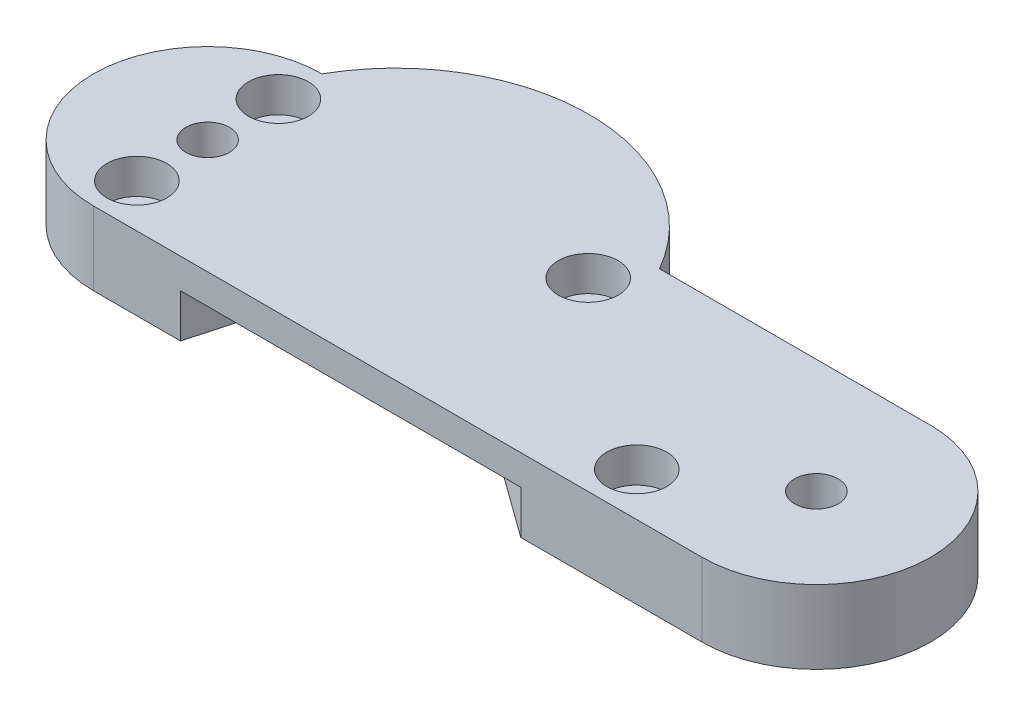
ISO-10303-21;
HEADER;
FILE_DESCRIPTION(('STEP AP214'),'2;1');
FILE_NAME('part.step','',(''),(''),'','','');
FILE_SCHEMA(('AUTOMOTIVE_DESIGN { 1 0 10303 214 1 1 1 1 }'));
ENDSEC;
DATA;
#1=APPLICATION_CONTEXT('core data for automotive mechanical design processes');
#2=APPLICATION_PROTOCOL_DEFINITION('international standard','automotive_design',2000,#1);
#3=PRODUCT_CONTEXT('',#1,'mechanical');
#4=PRODUCT('Part','Part','',(#3));
#5=PRODUCT_RELATED_PRODUCT_CATEGORY('part','',(#4));
#6=PRODUCT_DEFINITION_FORMATION('','',#4);
#7=PRODUCT_DEFINITION_CONTEXT('part definition',#1,'design');
#8=PRODUCT_DEFINITION('design','',#6,#7);
#9=PRODUCT_DEFINITION_SHAPE('','',#8);
#10=(LENGTH_UNIT() NAMED_UNIT(*) SI_UNIT(.MILLI.,.METRE.));
#11=(NAMED_UNIT(*) PLANE_ANGLE_UNIT() SI_UNIT($,.RADIAN.));
#12=(NAMED_UNIT(*) SI_UNIT($,.STERADIAN.) SOLID_ANGLE_UNIT());
#13=UNCERTAINTY_MEASURE_WITH_UNIT(LENGTH_MEASURE(1.E-05),#10,'distance_accuracy_value','');
#14=(GEOMETRIC_REPRESENTATION_CONTEXT(3) GLOBAL_UNCERTAINTY_ASSIGNED_CONTEXT((#13)) GLOBAL_UNIT_ASSIGNED_CONTEXT((#10,
#11,#12)) REPRESENTATION_CONTEXT('',''));
#15=CARTESIAN_POINT('',(0.,0.,0.));
#16=DIRECTION('',(0.,0.,1.));
#17=DIRECTION('',(1.,0.,0.));
#18=AXIS2_PLACEMENT_3D('',#15,#16,#17);
#19=CARTESIAN_POINT('',(0.,2.,0.));
#20=DIRECTION('',(0.,1.,0.));
#21=DIRECTION('',(0.,0.,-1.));
#22=AXIS2_PLACEMENT_3D('',#19,#20,#21);
#23=PLANE('',#22);
#24=CARTESIAN_POINT('',(-55.9305382801715,2.,-6.5003992165423));
#25=DIRECTION('',(0.,-1.,0.));
#26=DIRECTION('',(0.,0.,-1.));
#27=AXIS2_PLACEMENT_3D('',#24,#25,#26);
#28=CIRCLE('',#27,1.5);
#29=CARTESIAN_POINT('',(-55.9305382801715,2.,-8.00039921654231));
#30=VERTEX_POINT('',#29);
#31=EDGE_CURVE('E256',#30,#30,#28,.F.);
#32=ORIENTED_EDGE('',*,*,#31,.T.);
#33=EDGE_LOOP('',(#32));
#34=FACE_BOUND('',#33,.T.);
#35=CARTESIAN_POINT('',(-55.9305382801715,2.,0.));
#36=DIRECTION('',(0.,-1.,0.));
#37=DIRECTION('',(0.,0.,-1.));
#38=AXIS2_PLACEMENT_3D('',#35,#36,#37);
#39=CIRCLE('',#38,2.);
#40=CARTESIAN_POINT('',(-55.9305382801715,2.,-2.));
#41=VERTEX_POINT('',#40);
#42=EDGE_CURVE('E11',#41,#41,#39,.T.);
#43=ORIENTED_EDGE('',*,*,#42,.F.);
#44=EDGE_LOOP('',(#43));
#45=FACE_BOUND('',#44,.T.);
#46=CARTESIAN_POINT('',(-55.9305382801715,2.,0.));
#47=DIRECTION('',(0.,-1.,0.));
#48=DIRECTION('',(0.,0.,-1.));
#49=AXIS2_PLACEMENT_3D('',#46,#47,#48);
#50=CIRCLE('',#49,10.5003992165423);
#51=CARTESIAN_POINT('',(-55.9305382801715,2.,10.5003992165423));
#52=VERTEX_POINT('',#51);
#53=CARTESIAN_POINT('',(-55.9305382801715,2.,-10.5003992165423));
#54=VERTEX_POINT('',#53);
#55=EDGE_CURVE('E240',#52,#54,#50,.T.);
#56=ORIENTED_EDGE('',*,*,#55,.T.);
#57=CARTESIAN_POINT('',(-40.4241193156667,2.,-1.7460511013579));
#58=DIRECTION('',(0.,-1.,0.));
#59=DIRECTION('',(0.,0.,-1.));
#60=AXIS2_PLACEMENT_3D('',#57,#58,#59);
#61=CIRCLE('',#60,17.8069548217708);
#62=CARTESIAN_POINT('',(-54.8543825263999,2.,-12.1794179449777));
#63=VERTEX_POINT('',#62);
#64=EDGE_CURVE('E254',#54,#63,#61,.T.);
#65=ORIENTED_EDGE('',*,*,#64,.T.);
#66=DIRECTION('',(0.810372315489383,0.,0.585915275691269));
#67=VECTOR('',#66,1.);
#68=CARTESIAN_POINT('',(-43.8872651072943,2.,-4.24997427651618));
#69=LINE('',#68,#67);
#70=CARTESIAN_POINT('',(-43.8872651072943,2.,-4.24997427651618));
#71=VERTEX_POINT('',#70);
#72=EDGE_CURVE('E206',#63,#71,#69,.T.);
#73=ORIENTED_EDGE('',*,*,#72,.T.);
#74=DIRECTION('',(-0.263153614525289,0.,0.964753945398657));
#75=VECTOR('',#74,1.);
#76=CARTESIAN_POINT('',(-43.8872651072943,2.,-4.24997427651618));
#77=LINE('',#76,#75);
#78=CARTESIAN_POINT('',(-47.9106890267398,2.,10.5003992165423));
#79=VERTEX_POINT('',#78);
#80=EDGE_CURVE('E193',#71,#79,#77,.T.);
#81=ORIENTED_EDGE('',*,*,#80,.T.);
#82=DIRECTION('',(-1.,0.,0.));
#83=VECTOR('',#82,1.);
#84=CARTESIAN_POINT('',(0.,2.,10.5003992165423));
#85=LINE('',#84,#83);
#86=EDGE_CURVE('E251',#79,#52,#85,.T.);
#87=ORIENTED_EDGE('',*,*,#86,.T.);
#88=EDGE_LOOP('',(#56,#65,#73,#81,#87));
#89=FACE_BOUND('',#88,.T.);
#90=CARTESIAN_POINT('',(-55.9305382801715,2.,6.5003992165423));
#91=DIRECTION('',(0.,-1.,0.));
#92=DIRECTION('',(0.,0.,-1.));
#93=AXIS2_PLACEMENT_3D('',#90,#91,#92);
#94=CIRCLE('',#93,1.5);
#95=CARTESIAN_POINT('',(-55.9305382801715,2.,5.0003992165423));
#96=VERTEX_POINT('',#95);
#97=EDGE_CURVE('E261',#96,#96,#94,.F.);
#98=ORIENTED_EDGE('',*,*,#97,.T.);
#99=EDGE_LOOP('',(#98));
#100=FACE_BOUND('',#99,.T.);
#101=ADVANCED_FACE('F37',(#34,#45,#89,#100),#23,.F.);
#102=CARTESIAN_POINT('',(-41.5933955268113,2.,-5.05946240908561));
#103=DIRECTION('',(0.,-1.,0.));
#104=DIRECTION('',(0.,0.,1.));
#105=AXIS2_PLACEMENT_3D('',#102,#103,#104);
#106=PLANE('',#105);
#107=CARTESIAN_POINT('',(0.,2.,0.));
#108=DIRECTION('',(0.,1.,0.));
#109=DIRECTION('',(0.,0.,1.));
#110=AXIS2_PLACEMENT_3D('',#107,#108,#109);
#111=CIRCLE('',#110,2.);
#112=CARTESIAN_POINT('',(0.,2.,2.));
#113=VERTEX_POINT('',#112);
#114=EDGE_CURVE('E147',#113,#113,#111,.T.);
#115=ORIENTED_EDGE('',*,*,#114,.T.);
#116=EDGE_LOOP('',(#115));
#117=FACE_BOUND('',#116,.T.);
#118=DIRECTION('',(1.,0.,0.));
#119=VECTOR('',#118,1.);
#120=CARTESIAN_POINT('',(-12.458850175581,2.,-10.5003992165423));
#121=LINE('',#120,#119);
#122=CARTESIAN_POINT('',(-24.917700351162,2.,-10.5003992165423));
#123=VERTEX_POINT('',#122);
#124=CARTESIAN_POINT('',(0.,2.,-10.5003992165423));
#125=VERTEX_POINT('',#124);
#126=EDGE_CURVE('E128',#123,#125,#121,.T.);
#127=ORIENTED_EDGE('',*,*,#126,.T.);
#128=CARTESIAN_POINT('',(0.,2.,0.));
#129=DIRECTION('',(0.,1.,0.));
#130=DIRECTION('',(0.,0.,1.));
#131=AXIS2_PLACEMENT_3D('',#128,#129,#130);
#132=CIRCLE('',#131,10.5003992165423);
#133=CARTESIAN_POINT('',(0.,2.,10.5003992165423));
#134=VERTEX_POINT('',#133);
#135=EDGE_CURVE('E135',#125,#134,#132,.F.);
#136=ORIENTED_EDGE('',*,*,#135,.T.);
#137=DIRECTION('',(-1.,0.,0.));
#138=VECTOR('',#137,1.);
#139=CARTESIAN_POINT('',(-4.6195471407067,2.,10.5003992165423));
#140=LINE('',#139,#138);
#141=CARTESIAN_POINT('',(-16.659276720951,2.,10.5003992165423));
#142=VERTEX_POINT('',#141);
#143=EDGE_CURVE('E141',#134,#142,#140,.T.);
#144=ORIENTED_EDGE('',*,*,#143,.T.);
#145=DIRECTION('',(-0.810372315489383,0.,-0.585915275691269));
#146=VECTOR('',#145,1.);
#147=CARTESIAN_POINT('',(26.6452391554762,2.,41.8104240945407));
#148=LINE('',#147,#146);
#149=CARTESIAN_POINT('',(-39.2995259463282,2.,-5.86895054165502));
#150=VERTEX_POINT('',#149);
#151=EDGE_CURVE('E189',#142,#150,#148,.T.);
#152=ORIENTED_EDGE('',*,*,#151,.T.);
#153=DIRECTION('',(0.263153614525288,0.,-0.964753945398658));
#154=VECTOR('',#153,1.);
#155=CARTESIAN_POINT('',(-35.7518279113757,2.,-18.8752536565782));
#156=LINE('',#155,#154);
#157=CARTESIAN_POINT('',(-35.7381547906292,2.,-18.9253810211969));
#158=VERTEX_POINT('',#157);
#159=EDGE_CURVE('E204',#150,#158,#156,.T.);
#160=ORIENTED_EDGE('',*,*,#159,.T.);
#161=EDGE_CURVE('E146',#158,#123,#61,.T.);
#162=ORIENTED_EDGE('',*,*,#161,.T.);
#163=EDGE_LOOP('',(#127,#136,#144,#152,#160,#162));
#164=FACE_BOUND('',#163,.T.);
#165=CARTESIAN_POINT('',(-10.,2.,6.5003992165423));
#166=DIRECTION('',(0.,-1.,0.));
#167=DIRECTION('',(0.,0.,-1.));
#168=AXIS2_PLACEMENT_3D('',#165,#166,#167);
#169=CIRCLE('',#168,1.5);
#170=CARTESIAN_POINT('',(-10.,2.,5.0003992165423));
#171=VERTEX_POINT('',#170);
#172=EDGE_CURVE('E263',#171,#171,#169,.F.);
#173=ORIENTED_EDGE('',*,*,#172,.T.);
#174=EDGE_LOOP('',(#173));
#175=FACE_BOUND('',#174,.T.);
#176=CARTESIAN_POINT('',(-27.4615510728353,2.,-6.5003992165423));
#177=DIRECTION('',(0.,-1.,0.));
#178=DIRECTION('',(0.,0.,-1.));
#179=AXIS2_PLACEMENT_3D('',#176,#177,#178);
#180=CIRCLE('',#179,1.5);
#181=CARTESIAN_POINT('',(-27.4615510728353,2.,-8.00039921654231));
#182=VERTEX_POINT('',#181);
#183=EDGE_CURVE('E40',#182,#182,#180,.F.);
#184=ORIENTED_EDGE('',*,*,#183,.T.);
#185=EDGE_LOOP('',(#184));
#186=FACE_BOUND('',#185,.T.);
#187=ADVANCED_FACE('F143',(#117,#164,#175,#186),#106,.T.);
#188=CARTESIAN_POINT('',(-55.9305382801715,5.55,6.5003992165423));
#189=DIRECTION('',(0.,1.,0.));
#190=DIRECTION('',(0.,0.,-1.));
#191=AXIS2_PLACEMENT_3D('',#188,#189,#190);
#192=CYLINDRICAL_SURFACE('',#191,2.75);
#193=CARTESIAN_POINT('',(-55.9305382801715,5.55,6.5003992165423));
#194=DIRECTION('',(0.,-1.,0.));
#195=DIRECTION('',(0.,0.,-1.));
#196=AXIS2_PLACEMENT_3D('',#193,#194,#195);
#197=CIRCLE('',#196,2.75);
#198=CARTESIAN_POINT('',(-55.9305382801715,5.55,3.7503992165423));
#199=VERTEX_POINT('',#198);
#200=EDGE_CURVE('E172',#199,#199,#197,.T.);
#201=ORIENTED_EDGE('',*,*,#200,.T.);
#202=EDGE_LOOP('',(#201));
#203=FACE_BOUND('',#202,.T.);
#204=CARTESIAN_POINT('',(-55.9305382801715,8.75,6.5003992165423));
#205=DIRECTION('',(0.,-1.,0.));
#206=DIRECTION('',(0.,0.,-1.));
#207=AXIS2_PLACEMENT_3D('',#204,#205,#206);
#208=CIRCLE('',#207,2.75);
#209=CARTESIAN_POINT('',(-55.9305382801715,8.75,3.7503992165423));
#210=VERTEX_POINT('',#209);
#211=EDGE_CURVE('E157',#210,#210,#208,.T.);
#212=ORIENTED_EDGE('',*,*,#211,.F.);
#213=EDGE_LOOP('',(#212));
#214=FACE_BOUND('',#213,.T.);
#215=ADVANCED_FACE('F295',(#203,#214),#192,.F.);
#216=CARTESIAN_POINT('',(-55.9305382801715,5.55,-6.5003992165423));
#217=DIRECTION('',(0.,1.,0.));
#218=DIRECTION('',(0.,0.,-1.));
#219=AXIS2_PLACEMENT_3D('',#216,#217,#218);
#220=CYLINDRICAL_SURFACE('',#219,2.75);
#221=CARTESIAN_POINT('',(-55.9305382801715,5.55,-6.5003992165423));
#222=DIRECTION('',(0.,-1.,0.));
#223=DIRECTION('',(0.,0.,-1.));
#224=AXIS2_PLACEMENT_3D('',#221,#222,#223);
#225=CIRCLE('',#224,2.75);
#226=CARTESIAN_POINT('',(-55.9305382801715,5.55,-9.2503992165423));
#227=VERTEX_POINT('',#226);
#228=EDGE_CURVE('E154',#227,#227,#225,.T.);
#229=ORIENTED_EDGE('',*,*,#228,.T.);
#230=EDGE_LOOP('',(#229));
#231=FACE_BOUND('',#230,.T.);
#232=CARTESIAN_POINT('',(-55.9305382801715,8.75,-6.5003992165423));
#233=DIRECTION('',(0.,-1.,0.));
#234=DIRECTION('',(0.,0.,-1.));
#235=AXIS2_PLACEMENT_3D('',#232,#233,#234);
#236=CIRCLE('',#235,2.75);
#237=CARTESIAN_POINT('',(-55.9305382801715,8.75,-9.2503992165423));
#238=VERTEX_POINT('',#237);
#239=EDGE_CURVE('E158',#238,#238,#236,.T.);
#240=ORIENTED_EDGE('',*,*,#239,.F.);
#241=EDGE_LOOP('',(#240));
#242=FACE_BOUND('',#241,.T.);
#243=ADVANCED_FACE('F329',(#231,#242),#220,.F.);
#244=CARTESIAN_POINT('',(-27.4615510728353,5.55,-6.5003992165423));
#245=DIRECTION('',(0.,1.,0.));
#246=DIRECTION('',(0.,0.,-1.));
#247=AXIS2_PLACEMENT_3D('',#244,#245,#246);
#248=CYLINDRICAL_SURFACE('',#247,2.75);
#249=CARTESIAN_POINT('',(-27.4615510728353,5.55,-6.5003992165423));
#250=DIRECTION('',(0.,-1.,0.));
#251=DIRECTION('',(0.,0.,-1.));
#252=AXIS2_PLACEMENT_3D('',#249,#250,#251);
#253=CIRCLE('',#252,2.75);
#254=CARTESIAN_POINT('',(-27.4615510728353,5.55,-9.2503992165423));
#255=VERTEX_POINT('',#254);
#256=EDGE_CURVE('E161',#255,#255,#253,.T.);
#257=ORIENTED_EDGE('',*,*,#256,.T.);
#258=EDGE_LOOP('',(#257));
#259=FACE_BOUND('',#258,.T.);
#260=CARTESIAN_POINT('',(-27.4615510728353,8.75,-6.5003992165423));
#261=DIRECTION('',(0.,-1.,0.));
#262=DIRECTION('',(0.,0.,-1.));
#263=AXIS2_PLACEMENT_3D('',#260,#261,#262);
#264=CIRCLE('',#263,2.75);
#265=CARTESIAN_POINT('',(-27.4615510728353,8.75,-9.2503992165423));
#266=VERTEX_POINT('',#265);
#267=EDGE_CURVE('E164',#266,#266,#264,.T.);
#268=ORIENTED_EDGE('',*,*,#267,.F.);
#269=EDGE_LOOP('',(#268));
#270=FACE_BOUND('',#269,.T.);
#271=ADVANCED_FACE('F473',(#259,#270),#248,.F.);
#272=CARTESIAN_POINT('',(-10.,5.55,6.5003992165423));
#273=DIRECTION('',(0.,1.,0.));
#274=DIRECTION('',(0.,0.,-1.));
#275=AXIS2_PLACEMENT_3D('',#272,#273,#274);
#276=CYLINDRICAL_SURFACE('',#275,2.75);
#277=CARTESIAN_POINT('',(-10.,5.55,6.5003992165423));
#278=DIRECTION('',(0.,-1.,0.));
#279=DIRECTION('',(0.,0.,-1.));
#280=AXIS2_PLACEMENT_3D('',#277,#278,#279);
#281=CIRCLE('',#280,2.75);
#282=CARTESIAN_POINT('',(-10.,5.55,3.7503992165423));
#283=VERTEX_POINT('',#282);
#284=EDGE_CURVE('E167',#283,#283,#281,.T.);
#285=ORIENTED_EDGE('',*,*,#284,.T.);
#286=EDGE_LOOP('',(#285));
#287=FACE_BOUND('',#286,.T.);
#288=CARTESIAN_POINT('',(-10.,8.75,6.5003992165423));
#289=DIRECTION('',(0.,-1.,0.));
#290=DIRECTION('',(0.,0.,-1.));
#291=AXIS2_PLACEMENT_3D('',#288,#289,#290);
#292=CIRCLE('',#291,2.75);
#293=CARTESIAN_POINT('',(-10.,8.75,3.7503992165423));
#294=VERTEX_POINT('',#293);
#295=EDGE_CURVE('E150',#294,#294,#292,.T.);
#296=ORIENTED_EDGE('',*,*,#295,.F.);
#297=EDGE_LOOP('',(#296));
#298=FACE_BOUND('',#297,.T.);
#299=ADVANCED_FACE('F326',(#287,#298),#276,.F.);
#300=CARTESIAN_POINT('',(-35.7518279113757,6.,-18.8752536565782));
#301=DIRECTION('',(0.964753945398658,0.,0.263153614525288));
#302=DIRECTION('',(0.263153614525288,0.,-0.964753945398658));
#303=AXIS2_PLACEMENT_3D('',#300,#301,#302);
#304=PLANE('',#303);
#305=DIRECTION('',(0.263153614525288,0.,-0.964753945398658));
#306=VECTOR('',#305,1.);
#307=CARTESIAN_POINT('',(-35.7518279113757,6.,-18.8752536565782));
#308=LINE('',#307,#306);
#309=CARTESIAN_POINT('',(-39.2995259463282,6.,-5.86895054165502));
#310=VERTEX_POINT('',#309);
#311=CARTESIAN_POINT('',(-35.7381547906292,6.,-18.9253810211969));
#312=VERTEX_POINT('',#311);
#313=EDGE_CURVE('E192',#310,#312,#308,.T.);
#314=ORIENTED_EDGE('',*,*,#313,.T.);
#315=DIRECTION('',(0.,-1.,0.));
#316=VECTOR('',#315,1.);
#317=CARTESIAN_POINT('',(-35.7381547906292,6.,-18.9253810211969));
#318=LINE('',#317,#316);
#319=EDGE_CURVE('E181',#312,#158,#318,.T.);
#320=ORIENTED_EDGE('',*,*,#319,.T.);
#321=ORIENTED_EDGE('',*,*,#159,.F.);
#322=DIRECTION('',(0.,-1.,0.));
#323=VECTOR('',#322,1.);
#324=CARTESIAN_POINT('',(-39.2995259463282,6.,-5.86895054165502));
#325=LINE('',#324,#323);
#326=EDGE_CURVE('E201',#310,#150,#325,.T.);
#327=ORIENTED_EDGE('',*,*,#326,.F.);
#328=EDGE_LOOP('',(#314,#320,#321,#327));
#329=FACE_BOUND('',#328,.T.);
#330=ADVANCED_FACE('F336',(#329),#304,.F.);
#331=CARTESIAN_POINT('',(-40.4241193156667,-33.0570550282,-1.7460511013579));
#332=DIRECTION('',(0.,1.,0.));
#333=DIRECTION('',(0.,0.,-1.));
#334=AXIS2_PLACEMENT_3D('',#331,#332,#333);
#335=CYLINDRICAL_SURFACE('',#334,17.8069548217708);
#336=ORIENTED_EDGE('',*,*,#319,.F.);
#337=CARTESIAN_POINT('',(-40.4241193156667,6.,-1.7460511013579));
#338=DIRECTION('',(0.,1.,0.));
#339=DIRECTION('',(0.,0.,1.));
#340=AXIS2_PLACEMENT_3D('',#337,#338,#339);
#341=CIRCLE('',#340,17.8069548217708);
#342=CARTESIAN_POINT('',(-54.8543825263999,6.,-12.1794179449777));
#343=VERTEX_POINT('',#342);
#344=EDGE_CURVE('E178',#312,#343,#341,.T.);
#345=ORIENTED_EDGE('',*,*,#344,.T.);
#346=DIRECTION('',(0.,-1.,0.));
#347=VECTOR('',#346,1.);
#348=CARTESIAN_POINT('',(-54.8543825263999,6.,-12.1794179449777));
#349=LINE('',#348,#347);
#350=EDGE_CURVE('E183',#343,#63,#349,.T.);
#351=ORIENTED_EDGE('',*,*,#350,.T.);
#352=ORIENTED_EDGE('',*,*,#64,.F.);
#353=DIRECTION('',(0.,1.,0.));
#354=VECTOR('',#353,1.);
#355=CARTESIAN_POINT('',(-55.9305382801715,-0.75,-10.5003992165423));
#356=LINE('',#355,#354);
#357=CARTESIAN_POINT('',(-55.9305382801715,8.75,-10.5003992165423));
#358=VERTEX_POINT('',#357);
#359=EDGE_CURVE('E60',#54,#358,#356,.T.);
#360=ORIENTED_EDGE('',*,*,#359,.T.);
#361=CARTESIAN_POINT('',(-40.4241193156667,8.75,-1.7460511013579));
#362=DIRECTION('',(0.,1.,0.));
#363=DIRECTION('',(0.,0.,1.));
#364=AXIS2_PLACEMENT_3D('',#361,#362,#363);
#365=CIRCLE('',#364,17.8069548217708);
#366=CARTESIAN_POINT('',(-24.917700351162,8.75,-10.5003992165423));
#367=VERTEX_POINT('',#366);
#368=EDGE_CURVE('E185',#358,#367,#365,.F.);
#369=ORIENTED_EDGE('',*,*,#368,.T.);
#370=DIRECTION('',(0.,1.,0.));
#371=VECTOR('',#370,1.);
#372=CARTESIAN_POINT('',(-24.917700351162,-33.0570550282,-10.5003992165423));
#373=LINE('',#372,#371);
#374=EDGE_CURVE('E52',#123,#367,#373,.T.);
#375=ORIENTED_EDGE('',*,*,#374,.F.);
#376=ORIENTED_EDGE('',*,*,#161,.F.);
#377=EDGE_LOOP('',(#336,#345,#351,#352,#360,#369,#375,#376));
#378=FACE_BOUND('',#377,.T.);
#379=ADVANCED_FACE('F332',(#378),#335,.T.);
#380=CARTESIAN_POINT('',(-55.9305382801715,-0.75,0.));
#381=DIRECTION('',(0.,1.,0.));
#382=DIRECTION('',(0.,0.,-1.));
#383=AXIS2_PLACEMENT_3D('',#380,#381,#382);
#384=CYLINDRICAL_SURFACE('',#383,10.5003992165423);
#385=DIRECTION('',(0.,1.,0.));
#386=VECTOR('',#385,1.);
#387=CARTESIAN_POINT('',(-55.9305382801715,-0.75,10.5003992165423));
#388=LINE('',#387,#386);
#389=CARTESIAN_POINT('',(-55.9305382801715,8.75,10.5003992165423));
#390=VERTEX_POINT('',#389);
#391=EDGE_CURVE('E230',#52,#390,#388,.T.);
#392=ORIENTED_EDGE('',*,*,#391,.T.);
#393=CARTESIAN_POINT('',(-55.9305382801715,8.75,0.));
#394=DIRECTION('',(0.,1.,0.));
#395=DIRECTION('',(0.,0.,1.));
#396=AXIS2_PLACEMENT_3D('',#393,#394,#395);
#397=CIRCLE('',#396,10.5003992165423);
#398=EDGE_CURVE('E223',#358,#390,#397,.T.);
#399=ORIENTED_EDGE('',*,*,#398,.F.);
#400=ORIENTED_EDGE('',*,*,#359,.F.);
#401=ORIENTED_EDGE('',*,*,#55,.F.);
#402=EDGE_LOOP('',(#392,#399,#400,#401));
#403=FACE_BOUND('',#402,.T.);
#404=ADVANCED_FACE('F335',(#403),#384,.T.);
#405=CARTESIAN_POINT('',(-43.8872651072943,6.,-4.24997427651618));
#406=DIRECTION('',(-0.964753945398657,0.,-0.263153614525289));
#407=DIRECTION('',(-0.263153614525289,0.,0.964753945398657));
#408=AXIS2_PLACEMENT_3D('',#405,#406,#407);
#409=PLANE('',#408);
#410=DIRECTION('',(-0.263153614525289,0.,0.964753945398657));
#411=VECTOR('',#410,1.);
#412=CARTESIAN_POINT('',(-43.8872651072943,6.,-4.24997427651618));
#413=LINE('',#412,#411);
#414=CARTESIAN_POINT('',(-43.8872651072943,6.,-4.24997427651618));
#415=VERTEX_POINT('',#414);
#416=CARTESIAN_POINT('',(-47.9106890267398,6.,10.5003992165423));
#417=VERTEX_POINT('',#416);
#418=EDGE_CURVE('E198',#415,#417,#413,.T.);
#419=ORIENTED_EDGE('',*,*,#418,.T.);
#420=DIRECTION('',(0.,-1.,0.));
#421=VECTOR('',#420,1.);
#422=CARTESIAN_POINT('',(-47.9106890267398,-0.75,10.5003992165423));
#423=LINE('',#422,#421);
#424=EDGE_CURVE('E132',#417,#79,#423,.T.);
#425=ORIENTED_EDGE('',*,*,#424,.T.);
#426=ORIENTED_EDGE('',*,*,#80,.F.);
#427=DIRECTION('',(0.,-1.,0.));
#428=VECTOR('',#427,1.);
#429=CARTESIAN_POINT('',(-43.8872651072943,6.,-4.24997427651618));
#430=LINE('',#429,#428);
#431=EDGE_CURVE('E211',#415,#71,#430,.T.);
#432=ORIENTED_EDGE('',*,*,#431,.F.);
#433=EDGE_LOOP('',(#419,#425,#426,#432));
#434=FACE_BOUND('',#433,.T.);
#435=ADVANCED_FACE('F341',(#434),#409,.F.);
#436=CARTESIAN_POINT('',(-41.5933955268113,6.,-5.05946240908561));
#437=DIRECTION('',(0.,-1.,0.));
#438=DIRECTION('',(0.,0.,1.));
#439=AXIS2_PLACEMENT_3D('',#436,#437,#438);
#440=PLANE('',#439);
#441=ORIENTED_EDGE('',*,*,#313,.F.);
#442=DIRECTION('',(-0.810372315489383,0.,-0.585915275691269));
#443=VECTOR('',#442,1.);
#444=CARTESIAN_POINT('',(26.6452391554762,6.,41.8104240945407));
#445=LINE('',#444,#443);
#446=CARTESIAN_POINT('',(-16.659276720951,6.,10.5003992165423));
#447=VERTEX_POINT('',#446);
#448=EDGE_CURVE('E190',#447,#310,#445,.T.);
#449=ORIENTED_EDGE('',*,*,#448,.F.);
#450=DIRECTION('',(1.,0.,0.));
#451=VECTOR('',#450,1.);
#452=CARTESIAN_POINT('',(0.,6.,10.5003992165423));
#453=LINE('',#452,#451);
#454=EDGE_CURVE('E237',#417,#447,#453,.T.);
#455=ORIENTED_EDGE('',*,*,#454,.F.);
#456=ORIENTED_EDGE('',*,*,#418,.F.);
#457=DIRECTION('',(0.810372315489383,0.,0.585915275691269));
#458=VECTOR('',#457,1.);
#459=CARTESIAN_POINT('',(-43.8872651072943,6.,-4.24997427651618));
#460=LINE('',#459,#458);
#461=EDGE_CURVE('E196',#343,#415,#460,.T.);
#462=ORIENTED_EDGE('',*,*,#461,.F.);
#463=ORIENTED_EDGE('',*,*,#344,.F.);
#464=EDGE_LOOP('',(#441,#449,#455,#456,#462,#463));
#465=FACE_BOUND('',#464,.T.);
#466=ADVANCED_FACE('F337',(#465),#440,.T.);
#467=CARTESIAN_POINT('',(26.6452391554762,6.,41.8104240945407));
#468=DIRECTION('',(0.585915275691269,0.,-0.810372315489383));
#469=DIRECTION('',(-0.810372315489383,0.,-0.585915275691269));
#470=AXIS2_PLACEMENT_3D('',#467,#468,#469);
#471=PLANE('',#470);
#472=ORIENTED_EDGE('',*,*,#151,.F.);
#473=DIRECTION('',(0.,1.,0.));
#474=VECTOR('',#473,1.);
#475=CARTESIAN_POINT('',(-16.659276720951,-0.75,10.5003992165423));
#476=LINE('',#475,#474);
#477=EDGE_CURVE('E235',#142,#447,#476,.T.);
#478=ORIENTED_EDGE('',*,*,#477,.T.);
#479=ORIENTED_EDGE('',*,*,#448,.T.);
#480=ORIENTED_EDGE('',*,*,#326,.T.);
#481=EDGE_LOOP('',(#472,#478,#479,#480));
#482=FACE_BOUND('',#481,.T.);
#483=ADVANCED_FACE('F340',(#482),#471,.F.);
#484=CARTESIAN_POINT('',(0.,-0.75,-10.5003992165423));
#485=DIRECTION('',(0.,0.,1.));
#486=DIRECTION('',(1.,0.,0.));
#487=AXIS2_PLACEMENT_3D('',#484,#485,#486);
#488=PLANE('',#487);
#489=ORIENTED_EDGE('',*,*,#374,.T.);
#490=DIRECTION('',(-1.,0.,0.));
#491=VECTOR('',#490,1.);
#492=CARTESIAN_POINT('',(0.,8.75,-10.5003992165423));
#493=LINE('',#492,#491);
#494=CARTESIAN_POINT('',(0.,8.75,-10.5003992165423));
#495=VERTEX_POINT('',#494);
#496=EDGE_CURVE('E129',#495,#367,#493,.T.);
#497=ORIENTED_EDGE('',*,*,#496,.F.);
#498=DIRECTION('',(0.,1.,0.));
#499=VECTOR('',#498,1.);
#500=CARTESIAN_POINT('',(0.,-0.75,-10.5003992165423));
#501=LINE('',#500,#499);
#502=EDGE_CURVE('E124',#125,#495,#501,.T.);
#503=ORIENTED_EDGE('',*,*,#502,.F.);
#504=ORIENTED_EDGE('',*,*,#126,.F.);
#505=EDGE_LOOP('',(#489,#497,#503,#504));
#506=FACE_BOUND('',#505,.T.);
#507=ADVANCED_FACE('F126',(#506),#488,.F.);
#508=CARTESIAN_POINT('',(0.,8.75,0.));
#509=DIRECTION('',(0.,-1.,0.));
#510=DIRECTION('',(0.,0.,1.));
#511=AXIS2_PLACEMENT_3D('',#508,#509,#510);
#512=PLANE('',#511);
#513=ORIENTED_EDGE('',*,*,#295,.T.);
#514=EDGE_LOOP('',(#513));
#515=FACE_BOUND('',#514,.T.);
#516=ORIENTED_EDGE('',*,*,#267,.T.);
#517=EDGE_LOOP('',(#516));
#518=FACE_BOUND('',#517,.T.);
#519=ORIENTED_EDGE('',*,*,#239,.T.);
#520=EDGE_LOOP('',(#519));
#521=FACE_BOUND('',#520,.T.);
#522=ORIENTED_EDGE('',*,*,#211,.T.);
#523=EDGE_LOOP('',(#522));
#524=FACE_BOUND('',#523,.T.);
#525=CARTESIAN_POINT('',(0.,8.75,0.));
#526=DIRECTION('',(0.,1.,0.));
#527=DIRECTION('',(0.,0.,1.));
#528=AXIS2_PLACEMENT_3D('',#525,#526,#527);
#529=CIRCLE('',#528,10.5003992165423);
#530=CARTESIAN_POINT('',(0.,8.75,10.5003992165423));
#531=VERTEX_POINT('',#530);
#532=EDGE_CURVE('E220',#531,#495,#529,.T.);
#533=ORIENTED_EDGE('',*,*,#532,.T.);
#534=ORIENTED_EDGE('',*,*,#496,.T.);
#535=ORIENTED_EDGE('',*,*,#368,.F.);
#536=ORIENTED_EDGE('',*,*,#398,.T.);
#537=DIRECTION('',(1.,0.,0.));
#538=VECTOR('',#537,1.);
#539=CARTESIAN_POINT('',(0.,8.75,10.5003992165423));
#540=LINE('',#539,#538);
#541=EDGE_CURVE('E226',#390,#531,#540,.T.);
#542=ORIENTED_EDGE('',*,*,#541,.T.);
#543=EDGE_LOOP('',(#533,#534,#535,#536,#542));
#544=FACE_BOUND('',#543,.T.);
#545=CARTESIAN_POINT('',(0.,8.75,0.));
#546=DIRECTION('',(0.,1.,0.));
#547=DIRECTION('',(0.,0.,1.));
#548=AXIS2_PLACEMENT_3D('',#545,#546,#547);
#549=CIRCLE('',#548,2.);
#550=CARTESIAN_POINT('',(0.,8.75,2.));
#551=VERTEX_POINT('',#550);
#552=EDGE_CURVE('E217',#551,#551,#549,.T.);
#553=ORIENTED_EDGE('',*,*,#552,.F.);
#554=EDGE_LOOP('',(#553));
#555=FACE_BOUND('',#554,.T.);
#556=CARTESIAN_POINT('',(-55.9305382801715,8.75,0.));
#557=DIRECTION('',(0.,1.,0.));
#558=DIRECTION('',(0.,0.,1.));
#559=AXIS2_PLACEMENT_3D('',#556,#557,#558);
#560=CIRCLE('',#559,2.);
#561=CARTESIAN_POINT('',(-55.9305382801715,8.75,2.));
#562=VERTEX_POINT('',#561);
#563=EDGE_CURVE('E213',#562,#562,#560,.T.);
#564=ORIENTED_EDGE('',*,*,#563,.F.);
#565=EDGE_LOOP('',(#564));
#566=FACE_BOUND('',#565,.T.);
#567=ADVANCED_FACE('F364',(#515,#518,#521,#524,#544,#555,#566),#512,.F.);
#568=CARTESIAN_POINT('',(0.,-0.75,10.5003992165423));
#569=DIRECTION('',(0.,0.,-1.));
#570=DIRECTION('',(-1.,0.,0.));
#571=AXIS2_PLACEMENT_3D('',#568,#569,#570);
#572=PLANE('',#571);
#573=ORIENTED_EDGE('',*,*,#143,.F.);
#574=DIRECTION('',(0.,1.,0.));
#575=VECTOR('',#574,1.);
#576=CARTESIAN_POINT('',(0.,-0.75,10.5003992165423));
#577=LINE('',#576,#575);
#578=EDGE_CURVE('E137',#134,#531,#577,.T.);
#579=ORIENTED_EDGE('',*,*,#578,.T.);
#580=ORIENTED_EDGE('',*,*,#541,.F.);
#581=ORIENTED_EDGE('',*,*,#391,.F.);
#582=ORIENTED_EDGE('',*,*,#86,.F.);
#583=ORIENTED_EDGE('',*,*,#424,.F.);
#584=ORIENTED_EDGE('',*,*,#454,.T.);
#585=ORIENTED_EDGE('',*,*,#477,.F.);
#586=EDGE_LOOP('',(#573,#579,#580,#581,#582,#583,#584,#585));
#587=FACE_BOUND('',#586,.T.);
#588=ADVANCED_FACE('F367',(#587),#572,.F.);
#589=CARTESIAN_POINT('',(0.,-0.75,0.));
#590=DIRECTION('',(0.,1.,0.));
#591=DIRECTION('',(0.,0.,-1.));
#592=AXIS2_PLACEMENT_3D('',#589,#590,#591);
#593=CYLINDRICAL_SURFACE('',#592,10.5003992165423);
#594=ORIENTED_EDGE('',*,*,#135,.F.);
#595=ORIENTED_EDGE('',*,*,#502,.T.);
#596=ORIENTED_EDGE('',*,*,#532,.F.);
#597=ORIENTED_EDGE('',*,*,#578,.F.);
#598=EDGE_LOOP('',(#594,#595,#596,#597));
#599=FACE_BOUND('',#598,.T.);
#600=ADVANCED_FACE('F136',(#599),#593,.T.);
#601=CARTESIAN_POINT('',(0.,-0.75,0.));
#602=DIRECTION('',(0.,1.,0.));
#603=DIRECTION('',(0.,0.,-1.));
#604=AXIS2_PLACEMENT_3D('',#601,#602,#603);
#605=CYLINDRICAL_SURFACE('',#604,2.);
#606=ORIENTED_EDGE('',*,*,#552,.T.);
#607=EDGE_LOOP('',(#606));
#608=FACE_BOUND('',#607,.T.);
#609=ORIENTED_EDGE('',*,*,#114,.F.);
#610=EDGE_LOOP('',(#609));
#611=FACE_BOUND('',#610,.T.);
#612=ADVANCED_FACE('F350',(#608,#611),#605,.F.);
#613=CARTESIAN_POINT('',(-43.8872651072943,6.,-4.24997427651618));
#614=DIRECTION('',(-0.585915275691269,0.,0.810372315489383));
#615=DIRECTION('',(0.810372315489383,0.,0.585915275691269));
#616=AXIS2_PLACEMENT_3D('',#613,#614,#615);
#617=PLANE('',#616);
#618=ORIENTED_EDGE('',*,*,#72,.F.);
#619=ORIENTED_EDGE('',*,*,#350,.F.);
#620=ORIENTED_EDGE('',*,*,#461,.T.);
#621=ORIENTED_EDGE('',*,*,#431,.T.);
#622=EDGE_LOOP('',(#618,#619,#620,#621));
#623=FACE_BOUND('',#622,.T.);
#624=ADVANCED_FACE('F346',(#623),#617,.F.);
#625=CARTESIAN_POINT('',(-55.9305382801715,-0.75,0.));
#626=DIRECTION('',(0.,1.,0.));
#627=DIRECTION('',(0.,0.,-1.));
#628=AXIS2_PLACEMENT_3D('',#625,#626,#627);
#629=CYLINDRICAL_SURFACE('',#628,2.);
#630=ORIENTED_EDGE('',*,*,#42,.T.);
#631=EDGE_LOOP('',(#630));
#632=FACE_BOUND('',#631,.T.);
#633=ORIENTED_EDGE('',*,*,#563,.T.);
#634=EDGE_LOOP('',(#633));
#635=FACE_BOUND('',#634,.T.);
#636=ADVANCED_FACE('F349',(#632,#635),#629,.F.);
#637=CARTESIAN_POINT('',(-55.9305382801715,5.55,-6.5003992165423));
#638=DIRECTION('',(0.,1.,0.));
#639=DIRECTION('',(0.,0.,-1.));
#640=AXIS2_PLACEMENT_3D('',#637,#638,#639);
#641=PLANE('',#640);
#642=ORIENTED_EDGE('',*,*,#228,.F.);
#643=EDGE_LOOP('',(#642));
#644=FACE_BOUND('',#643,.T.);
#645=CARTESIAN_POINT('',(-55.9305382801715,5.55,-6.5003992165423));
#646=DIRECTION('',(0.,-1.,0.));
#647=DIRECTION('',(0.,0.,-1.));
#648=AXIS2_PLACEMENT_3D('',#645,#646,#647);
#649=CIRCLE('',#648,1.5);
#650=CARTESIAN_POINT('',(-55.9305382801715,5.55,-8.00039921654231));
#651=VERTEX_POINT('',#650);
#652=EDGE_CURVE('E175',#651,#651,#649,.F.);
#653=ORIENTED_EDGE('',*,*,#652,.F.);
#654=EDGE_LOOP('',(#653));
#655=FACE_BOUND('',#654,.T.);
#656=ADVANCED_FACE('F320',(#644,#655),#641,.T.);
#657=CARTESIAN_POINT('',(-55.9305382801715,-0.75,-6.5003992165423));
#658=DIRECTION('',(0.,1.,0.));
#659=DIRECTION('',(0.,0.,-1.));
#660=AXIS2_PLACEMENT_3D('',#657,#658,#659);
#661=CYLINDRICAL_SURFACE('',#660,1.5);
#662=ORIENTED_EDGE('',*,*,#31,.F.);
#663=EDGE_LOOP('',(#662));
#664=FACE_BOUND('',#663,.T.);
#665=ORIENTED_EDGE('',*,*,#652,.T.);
#666=EDGE_LOOP('',(#665));
#667=FACE_BOUND('',#666,.T.);
#668=ADVANCED_FACE('F314',(#664,#667),#661,.F.);
#669=CARTESIAN_POINT('',(-55.9305382801715,5.55,6.5003992165423));
#670=DIRECTION('',(0.,1.,0.));
#671=DIRECTION('',(0.,0.,-1.));
#672=AXIS2_PLACEMENT_3D('',#669,#670,#671);
#673=PLANE('',#672);
#674=ORIENTED_EDGE('',*,*,#200,.F.);
#675=EDGE_LOOP('',(#674));
#676=FACE_BOUND('',#675,.T.);
#677=CARTESIAN_POINT('',(-55.9305382801715,5.55,6.5003992165423));
#678=DIRECTION('',(0.,-1.,0.));
#679=DIRECTION('',(0.,0.,-1.));
#680=AXIS2_PLACEMENT_3D('',#677,#678,#679);
#681=CIRCLE('',#680,1.5);
#682=CARTESIAN_POINT('',(-55.9305382801715,5.55,5.0003992165423));
#683=VERTEX_POINT('',#682);
#684=EDGE_CURVE('E243',#683,#683,#681,.F.);
#685=ORIENTED_EDGE('',*,*,#684,.F.);
#686=EDGE_LOOP('',(#685));
#687=FACE_BOUND('',#686,.T.);
#688=ADVANCED_FACE('F309',(#676,#687),#673,.T.);
#689=CARTESIAN_POINT('',(-55.9305382801715,-0.75,6.5003992165423));
#690=DIRECTION('',(0.,1.,0.));
#691=DIRECTION('',(0.,0.,-1.));
#692=AXIS2_PLACEMENT_3D('',#689,#690,#691);
#693=CYLINDRICAL_SURFACE('',#692,1.5);
#694=ORIENTED_EDGE('',*,*,#97,.F.);
#695=EDGE_LOOP('',(#694));
#696=FACE_BOUND('',#695,.T.);
#697=ORIENTED_EDGE('',*,*,#684,.T.);
#698=EDGE_LOOP('',(#697));
#699=FACE_BOUND('',#698,.T.);
#700=ADVANCED_FACE('F306',(#696,#699),#693,.F.);
#701=CARTESIAN_POINT('',(-10.,5.55,6.5003992165423));
#702=DIRECTION('',(0.,1.,0.));
#703=DIRECTION('',(0.,0.,-1.));
#704=AXIS2_PLACEMENT_3D('',#701,#702,#703);
#705=PLANE('',#704);
#706=ORIENTED_EDGE('',*,*,#284,.F.);
#707=EDGE_LOOP('',(#706));
#708=FACE_BOUND('',#707,.T.);
#709=CARTESIAN_POINT('',(-10.,5.55,6.5003992165423));
#710=DIRECTION('',(0.,-1.,0.));
#711=DIRECTION('',(0.,0.,-1.));
#712=AXIS2_PLACEMENT_3D('',#709,#710,#711);
#713=CIRCLE('',#712,1.5);
#714=CARTESIAN_POINT('',(-10.,5.55,5.0003992165423));
#715=VERTEX_POINT('',#714);
#716=EDGE_CURVE('E246',#715,#715,#713,.F.);
#717=ORIENTED_EDGE('',*,*,#716,.F.);
#718=EDGE_LOOP('',(#717));
#719=FACE_BOUND('',#718,.T.);
#720=ADVANCED_FACE('F284',(#708,#719),#705,.T.);
#721=CARTESIAN_POINT('',(-10.,-0.75,6.5003992165423));
#722=DIRECTION('',(0.,1.,0.));
#723=DIRECTION('',(0.,0.,-1.));
#724=AXIS2_PLACEMENT_3D('',#721,#722,#723);
#725=CYLINDRICAL_SURFACE('',#724,1.5);
#726=ORIENTED_EDGE('',*,*,#172,.F.);
#727=EDGE_LOOP('',(#726));
#728=FACE_BOUND('',#727,.T.);
#729=ORIENTED_EDGE('',*,*,#716,.T.);
#730=EDGE_LOOP('',(#729));
#731=FACE_BOUND('',#730,.T.);
#732=ADVANCED_FACE('F278',(#728,#731),#725,.F.);
#733=CARTESIAN_POINT('',(-27.4615510728353,5.55,-6.5003992165423));
#734=DIRECTION('',(0.,1.,0.));
#735=DIRECTION('',(0.,0.,-1.));
#736=AXIS2_PLACEMENT_3D('',#733,#734,#735);
#737=PLANE('',#736);
#738=ORIENTED_EDGE('',*,*,#256,.F.);
#739=EDGE_LOOP('',(#738));
#740=FACE_BOUND('',#739,.T.);
#741=CARTESIAN_POINT('',(-27.4615510728353,5.55,-6.5003992165423));
#742=DIRECTION('',(0.,-1.,0.));
#743=DIRECTION('',(0.,0.,-1.));
#744=AXIS2_PLACEMENT_3D('',#741,#742,#743);
#745=CIRCLE('',#744,1.5);
#746=CARTESIAN_POINT('',(-27.4615510728353,5.55,-8.00039921654231));
#747=VERTEX_POINT('',#746);
#748=EDGE_CURVE('E182',#747,#747,#745,.F.);
#749=ORIENTED_EDGE('',*,*,#748,.F.);
#750=EDGE_LOOP('',(#749));
#751=FACE_BOUND('',#750,.T.);
#752=ADVANCED_FACE('F273',(#740,#751),#737,.T.);
#753=CARTESIAN_POINT('',(-27.4615510728353,-0.75,-6.5003992165423));
#754=DIRECTION('',(0.,1.,0.));
#755=DIRECTION('',(0.,0.,-1.));
#756=AXIS2_PLACEMENT_3D('',#753,#754,#755);
#757=CYLINDRICAL_SURFACE('',#756,1.5);
#758=ORIENTED_EDGE('',*,*,#183,.F.);
#759=EDGE_LOOP('',(#758));
#760=FACE_BOUND('',#759,.T.);
#761=ORIENTED_EDGE('',*,*,#748,.T.);
#762=EDGE_LOOP('',(#761));
#763=FACE_BOUND('',#762,.T.);
#764=ADVANCED_FACE('F270',(#760,#763),#757,.F.);
#765=CLOSED_SHELL('',(#101,#187,#215,#243,#271,#299,#330,#379,#404,#435,#466,#483,#507,#567,
#588,#600,#612,#624,#636,#656,#668,#688,#700,#720,#732,#752,#764));
#766=MANIFOLD_SOLID_BREP('B2',#765);
#767=ADVANCED_BREP_SHAPE_REPRESENTATION('',(#18,#766),#14);
#768=SHAPE_DEFINITION_REPRESENTATION(#9,#767);
ENDSEC;
END-ISO-10303-21;
